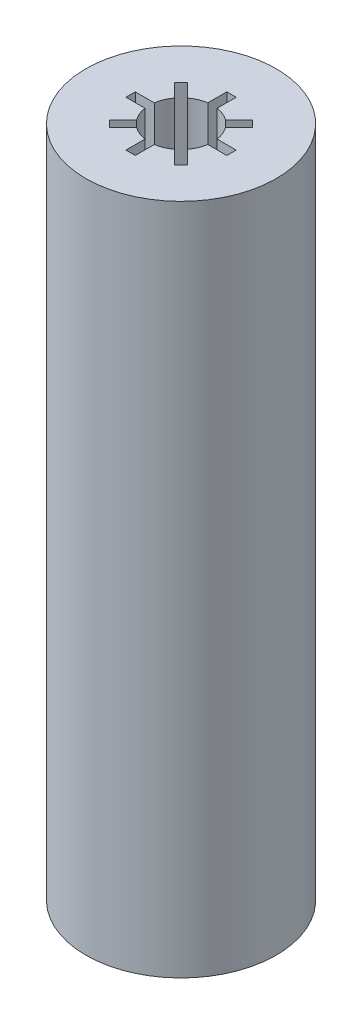
ISO-10303-21;
HEADER;
FILE_DESCRIPTION(('STEP AP214'),'2;1');
FILE_NAME('part.step','',(''),(''),'','','');
FILE_SCHEMA(('AUTOMOTIVE_DESIGN { 1 0 10303 214 1 1 1 1 }'));
ENDSEC;
DATA;
#1=APPLICATION_CONTEXT('core data for automotive mechanical design processes');
#2=APPLICATION_PROTOCOL_DEFINITION('international standard','automotive_design',2000,#1);
#3=PRODUCT_CONTEXT('',#1,'mechanical');
#4=PRODUCT('Part','Part','',(#3));
#5=PRODUCT_RELATED_PRODUCT_CATEGORY('part','',(#4));
#6=PRODUCT_DEFINITION_FORMATION('','',#4);
#7=PRODUCT_DEFINITION_CONTEXT('part definition',#1,'design');
#8=PRODUCT_DEFINITION('design','',#6,#7);
#9=PRODUCT_DEFINITION_SHAPE('','',#8);
#10=(LENGTH_UNIT() NAMED_UNIT(*) SI_UNIT(.MILLI.,.METRE.));
#11=(NAMED_UNIT(*) PLANE_ANGLE_UNIT() SI_UNIT($,.RADIAN.));
#12=(NAMED_UNIT(*) SI_UNIT($,.STERADIAN.) SOLID_ANGLE_UNIT());
#13=UNCERTAINTY_MEASURE_WITH_UNIT(LENGTH_MEASURE(1.E-05),#10,'distance_accuracy_value','');
#14=(GEOMETRIC_REPRESENTATION_CONTEXT(3) GLOBAL_UNCERTAINTY_ASSIGNED_CONTEXT((#13)) GLOBAL_UNIT_ASSIGNED_CONTEXT((#10,
#11,#12)) REPRESENTATION_CONTEXT('',''));
#15=CARTESIAN_POINT('',(0.,0.,0.));
#16=DIRECTION('',(0.,0.,1.));
#17=DIRECTION('',(1.,0.,0.));
#18=AXIS2_PLACEMENT_3D('',#15,#16,#17);
#19=CARTESIAN_POINT('',(0.,457.2,0.));
#20=DIRECTION('',(0.,-1.,0.));
#21=DIRECTION('',(0.,0.,-1.));
#22=AXIS2_PLACEMENT_3D('',#19,#20,#21);
#23=CYLINDRICAL_SURFACE('',#22,21.59);
#24=DIRECTION('',(0.,1.,0.));
#25=VECTOR('',#24,1.);
#26=CARTESIAN_POINT('',(21.3552680854163,-0.000999999999973245,3.17500000000007));
#27=LINE('',#26,#25);
#28=CARTESIAN_POINT('',(21.3552680854163,0.,3.17500000000007));
#29=VERTEX_POINT('',#28);
#30=CARTESIAN_POINT('',(21.3552680854163,457.2,3.17500000000007));
#31=VERTEX_POINT('',#30);
#32=EDGE_CURVE('E376',#29,#31,#27,.T.);
#33=ORIENTED_EDGE('',*,*,#32,.F.);
#34=CARTESIAN_POINT('',(0.,0.,0.));
#35=DIRECTION('',(0.,1.,0.));
#36=DIRECTION('',(0.,0.,1.));
#37=AXIS2_PLACEMENT_3D('',#34,#35,#36);
#38=CIRCLE('',#37,21.59);
#39=CARTESIAN_POINT('',(17.3455189075217,0.,12.8553908469873));
#40=VERTEX_POINT('',#39);
#41=EDGE_CURVE('E588',#40,#29,#38,.T.);
#42=ORIENTED_EDGE('',*,*,#41,.F.);
#43=DIRECTION('',(0.,1.,0.));
#44=VECTOR('',#43,1.);
#45=CARTESIAN_POINT('',(17.3455189075217,-0.000999999999973245,12.8553908469873));
#46=LINE('',#45,#44);
#47=CARTESIAN_POINT('',(17.3455189075217,457.2,12.8553908469873));
#48=VERTEX_POINT('',#47);
#49=EDGE_CURVE('E415',#40,#48,#46,.T.);
#50=ORIENTED_EDGE('',*,*,#49,.T.);
#51=CARTESIAN_POINT('',(0.,457.2,0.));
#52=DIRECTION('',(0.,1.,0.));
#53=DIRECTION('',(0.,0.,1.));
#54=AXIS2_PLACEMENT_3D('',#51,#52,#53);
#55=CIRCLE('',#54,21.59);
#56=EDGE_CURVE('E666',#48,#31,#55,.T.);
#57=ORIENTED_EDGE('',*,*,#56,.T.);
#58=EDGE_LOOP('',(#33,#42,#50,#57));
#59=FACE_BOUND('',#58,.T.);
#60=ADVANCED_FACE('F47',(#59),#23,.F.);
#61=DIRECTION('',(0.,1.,0.));
#62=VECTOR('',#61,1.);
#63=CARTESIAN_POINT('',(12.8553908469871,-0.000999999999973245,17.3455189075219));
#64=LINE('',#63,#62);
#65=CARTESIAN_POINT('',(12.8553908469871,0.,17.3455189075219));
#66=VERTEX_POINT('',#65);
#67=CARTESIAN_POINT('',(12.8553908469871,457.2,17.3455189075219));
#68=VERTEX_POINT('',#67);
#69=EDGE_CURVE('E412',#66,#68,#64,.T.);
#70=ORIENTED_EDGE('',*,*,#69,.F.);
#71=CARTESIAN_POINT('',(3.175,0.,21.3552680854163));
#72=VERTEX_POINT('',#71);
#73=EDGE_CURVE('E593',#72,#66,#38,.T.);
#74=ORIENTED_EDGE('',*,*,#73,.F.);
#75=DIRECTION('',(0.,1.,0.));
#76=VECTOR('',#75,1.);
#77=CARTESIAN_POINT('',(3.175,-0.000999999999973245,21.3552680854163));
#78=LINE('',#77,#76);
#79=CARTESIAN_POINT('',(3.175,457.2,21.3552680854163));
#80=VERTEX_POINT('',#79);
#81=EDGE_CURVE('E450',#72,#80,#78,.T.);
#82=ORIENTED_EDGE('',*,*,#81,.T.);
#83=EDGE_CURVE('E652',#80,#68,#55,.T.);
#84=ORIENTED_EDGE('',*,*,#83,.T.);
#85=EDGE_LOOP('',(#70,#74,#82,#84));
#86=FACE_BOUND('',#85,.T.);
#87=ADVANCED_FACE('F650',(#86),#23,.F.);
#88=DIRECTION('',(0.,1.,0.));
#89=VECTOR('',#88,1.);
#90=CARTESIAN_POINT('',(-3.175,-0.000999999999973245,21.3552680854163));
#91=LINE('',#90,#89);
#92=CARTESIAN_POINT('',(-3.175,0.,21.3552680854163));
#93=VERTEX_POINT('',#92);
#94=CARTESIAN_POINT('',(-3.175,457.2,21.3552680854163));
#95=VERTEX_POINT('',#94);
#96=EDGE_CURVE('E447',#93,#95,#91,.T.);
#97=ORIENTED_EDGE('',*,*,#96,.F.);
#98=CARTESIAN_POINT('',(-12.8553908469874,0.,17.3455189075217));
#99=VERTEX_POINT('',#98);
#100=EDGE_CURVE('E599',#99,#93,#38,.T.);
#101=ORIENTED_EDGE('',*,*,#100,.F.);
#102=DIRECTION('',(0.,1.,0.));
#103=VECTOR('',#102,1.);
#104=CARTESIAN_POINT('',(-12.8553908469874,-0.000999999999973245,17.3455189075217));
#105=LINE('',#104,#103);
#106=CARTESIAN_POINT('',(-12.8553908469874,457.2,17.3455189075217));
#107=VERTEX_POINT('',#106);
#108=EDGE_CURVE('E483',#99,#107,#105,.T.);
#109=ORIENTED_EDGE('',*,*,#108,.T.);
#110=EDGE_CURVE('E637',#107,#95,#55,.T.);
#111=ORIENTED_EDGE('',*,*,#110,.T.);
#112=EDGE_LOOP('',(#97,#101,#109,#111));
#113=FACE_BOUND('',#112,.T.);
#114=ADVANCED_FACE('F635',(#113),#23,.F.);
#115=DIRECTION('',(0.,1.,0.));
#116=VECTOR('',#115,1.);
#117=CARTESIAN_POINT('',(-17.3455189075219,-0.000999999999973245,12.8553908469871));
#118=LINE('',#117,#116);
#119=CARTESIAN_POINT('',(-17.3455189075219,0.,12.8553908469871));
#120=VERTEX_POINT('',#119);
#121=CARTESIAN_POINT('',(-17.3455189075219,457.2,12.8553908469871));
#122=VERTEX_POINT('',#121);
#123=EDGE_CURVE('E480',#120,#122,#118,.T.);
#124=ORIENTED_EDGE('',*,*,#123,.F.);
#125=CARTESIAN_POINT('',(-21.3552680854163,0.,3.17499999999978));
#126=VERTEX_POINT('',#125);
#127=EDGE_CURVE('E580',#126,#120,#38,.T.);
#128=ORIENTED_EDGE('',*,*,#127,.F.);
#129=DIRECTION('',(0.,1.,0.));
#130=VECTOR('',#129,1.);
#131=CARTESIAN_POINT('',(-21.3552680854163,-0.000999999999973245,3.17499999999978));
#132=LINE('',#131,#130);
#133=CARTESIAN_POINT('',(-21.3552680854163,457.2,3.17499999999978));
#134=VERTEX_POINT('',#133);
#135=EDGE_CURVE('E317',#126,#134,#132,.T.);
#136=ORIENTED_EDGE('',*,*,#135,.T.);
#137=EDGE_CURVE('E618',#134,#122,#55,.T.);
#138=ORIENTED_EDGE('',*,*,#137,.T.);
#139=EDGE_LOOP('',(#124,#128,#136,#138));
#140=FACE_BOUND('',#139,.T.);
#141=ADVANCED_FACE('F615',(#140),#23,.F.);
#142=DIRECTION('',(0.,1.,0.));
#143=VECTOR('',#142,1.);
#144=CARTESIAN_POINT('',(-21.3552680854163,-0.000999999999973245,-3.17500000000022));
#145=LINE('',#144,#143);
#146=CARTESIAN_POINT('',(-21.3552680854163,0.,-3.17500000000022));
#147=VERTEX_POINT('',#146);
#148=CARTESIAN_POINT('',(-21.3552680854163,457.2,-3.17500000000022));
#149=VERTEX_POINT('',#148);
#150=EDGE_CURVE('E292',#147,#149,#145,.T.);
#151=ORIENTED_EDGE('',*,*,#150,.F.);
#152=CARTESIAN_POINT('',(-17.3455189075217,0.,-12.8553908469874));
#153=VERTEX_POINT('',#152);
#154=EDGE_CURVE('E300',#153,#147,#38,.T.);
#155=ORIENTED_EDGE('',*,*,#154,.F.);
#156=DIRECTION('',(0.,1.,0.));
#157=VECTOR('',#156,1.);
#158=CARTESIAN_POINT('',(-17.3455189075217,-0.000999999999973245,-12.8553908469874));
#159=LINE('',#158,#157);
#160=CARTESIAN_POINT('',(-17.3455189075217,457.2,-12.8553908469875));
#161=VERTEX_POINT('',#160);
#162=EDGE_CURVE('E345',#153,#161,#159,.T.);
#163=ORIENTED_EDGE('',*,*,#162,.T.);
#164=EDGE_CURVE('E569',#161,#149,#55,.T.);
#165=ORIENTED_EDGE('',*,*,#164,.T.);
#166=EDGE_LOOP('',(#151,#155,#163,#165));
#167=FACE_BOUND('',#166,.T.);
#168=ADVANCED_FACE('F713',(#167),#23,.F.);
#169=DIRECTION('',(0.,1.,0.));
#170=VECTOR('',#169,1.);
#171=CARTESIAN_POINT('',(-12.855390846987,-0.000999999999973245,-17.345518907522));
#172=LINE('',#171,#170);
#173=CARTESIAN_POINT('',(-12.855390846987,0.,-17.345518907522));
#174=VERTEX_POINT('',#173);
#175=CARTESIAN_POINT('',(-12.855390846987,457.2,-17.345518907522));
#176=VERTEX_POINT('',#175);
#177=EDGE_CURVE('E342',#174,#176,#172,.T.);
#178=ORIENTED_EDGE('',*,*,#177,.F.);
#179=CARTESIAN_POINT('',(-3.175,0.,-21.3552680854163));
#180=VERTEX_POINT('',#179);
#181=EDGE_CURVE('E571',#180,#174,#38,.T.);
#182=ORIENTED_EDGE('',*,*,#181,.F.);
#183=DIRECTION('',(0.,1.,0.));
#184=VECTOR('',#183,1.);
#185=CARTESIAN_POINT('',(-3.175,-0.000999999999973245,-21.3552680854163));
#186=LINE('',#185,#184);
#187=CARTESIAN_POINT('',(-3.175,457.2,-21.3552680854163));
#188=VERTEX_POINT('',#187);
#189=EDGE_CURVE('E552',#180,#188,#186,.T.);
#190=ORIENTED_EDGE('',*,*,#189,.T.);
#191=EDGE_CURVE('E565',#188,#176,#55,.T.);
#192=ORIENTED_EDGE('',*,*,#191,.T.);
#193=EDGE_LOOP('',(#178,#182,#190,#192));
#194=FACE_BOUND('',#193,.T.);
#195=ADVANCED_FACE('F701',(#194),#23,.F.);
#196=DIRECTION('',(0.,1.,0.));
#197=VECTOR('',#196,1.);
#198=CARTESIAN_POINT('',(21.3552680854163,-0.000999999999973245,-3.17499999999993));
#199=LINE('',#198,#197);
#200=CARTESIAN_POINT('',(21.3552680854163,0.,-3.17499999999993));
#201=VERTEX_POINT('',#200);
#202=CARTESIAN_POINT('',(21.3552680854163,457.2,-3.17499999999993));
#203=VERTEX_POINT('',#202);
#204=EDGE_CURVE('E380',#201,#203,#199,.T.);
#205=ORIENTED_EDGE('',*,*,#204,.T.);
#206=CARTESIAN_POINT('',(17.3455189075218,457.2,-12.8553908469872));
#207=VERTEX_POINT('',#206);
#208=EDGE_CURVE('E579',#203,#207,#55,.T.);
#209=ORIENTED_EDGE('',*,*,#208,.T.);
#210=DIRECTION('',(0.,1.,0.));
#211=VECTOR('',#210,1.);
#212=CARTESIAN_POINT('',(17.3455189075218,-0.000999999999973245,-12.8553908469872));
#213=LINE('',#212,#211);
#214=CARTESIAN_POINT('',(17.3455189075218,0.,-12.8553908469872));
#215=VERTEX_POINT('',#214);
#216=EDGE_CURVE('E512',#215,#207,#213,.T.);
#217=ORIENTED_EDGE('',*,*,#216,.F.);
#218=EDGE_CURVE('E582',#201,#215,#38,.T.);
#219=ORIENTED_EDGE('',*,*,#218,.F.);
#220=EDGE_LOOP('',(#205,#209,#217,#219));
#221=FACE_BOUND('',#220,.T.);
#222=ADVANCED_FACE('F676',(#221),#23,.F.);
#223=CARTESIAN_POINT('',(0.,457.2,0.));
#224=DIRECTION('',(0.,1.,0.));
#225=DIRECTION('',(0.,0.,1.));
#226=AXIS2_PLACEMENT_3D('',#223,#224,#225);
#227=PLANE('',#226);
#228=DIRECTION('',(1.,0.,0.));
#229=VECTOR('',#228,1.);
#230=CARTESIAN_POINT('',(34.29,457.2,3.17500000000012));
#231=LINE('',#230,#229);
#232=CARTESIAN_POINT('',(34.29,457.2,3.17500000000012));
#233=VERTEX_POINT('',#232);
#234=EDGE_CURVE('E365',#31,#233,#231,.T.);
#235=ORIENTED_EDGE('',*,*,#234,.F.);
#236=ORIENTED_EDGE('',*,*,#56,.F.);
#237=DIRECTION('',(-0.707106781186544,0.,-0.707106781186551));
#238=VECTOR('',#237,1.);
#239=CARTESIAN_POINT('',(26.4917555571539,457.2,22.0016274966196));
#240=LINE('',#239,#238);
#241=CARTESIAN_POINT('',(26.4917555571539,457.2,22.0016274966196));
#242=VERTEX_POINT('',#241);
#243=EDGE_CURVE('E408',#242,#48,#240,.T.);
#244=ORIENTED_EDGE('',*,*,#243,.F.);
#245=DIRECTION('',(0.707106781186551,0.,-0.707106781186544));
#246=VECTOR('',#245,1.);
#247=CARTESIAN_POINT('',(26.4917555571539,457.2,22.0016274966196));
#248=LINE('',#247,#246);
#249=CARTESIAN_POINT('',(22.0016274966193,457.2,26.4917555571541));
#250=VERTEX_POINT('',#249);
#251=EDGE_CURVE('E404',#250,#242,#248,.T.);
#252=ORIENTED_EDGE('',*,*,#251,.F.);
#253=DIRECTION('',(0.707106781186544,0.,0.707106781186551));
#254=VECTOR('',#253,1.);
#255=CARTESIAN_POINT('',(22.0016274966193,457.2,26.4917555571541));
#256=LINE('',#255,#254);
#257=EDGE_CURVE('E400',#68,#250,#256,.T.);
#258=ORIENTED_EDGE('',*,*,#257,.F.);
#259=ORIENTED_EDGE('',*,*,#83,.F.);
#260=DIRECTION('',(0.,0.,-1.));
#261=VECTOR('',#260,1.);
#262=CARTESIAN_POINT('',(3.175,457.2,34.29));
#263=LINE('',#262,#261);
#264=CARTESIAN_POINT('',(3.175,457.2,34.29));
#265=VERTEX_POINT('',#264);
#266=EDGE_CURVE('E443',#265,#80,#263,.T.);
#267=ORIENTED_EDGE('',*,*,#266,.F.);
#268=DIRECTION('',(1.,0.,0.));
#269=VECTOR('',#268,1.);
#270=CARTESIAN_POINT('',(3.175,457.2,34.29));
#271=LINE('',#270,#269);
#272=CARTESIAN_POINT('',(-3.175,457.2,34.29));
#273=VERTEX_POINT('',#272);
#274=EDGE_CURVE('E439',#273,#265,#271,.T.);
#275=ORIENTED_EDGE('',*,*,#274,.F.);
#276=DIRECTION('',(0.,0.,1.));
#277=VECTOR('',#276,1.);
#278=CARTESIAN_POINT('',(-3.175,457.2,34.29));
#279=LINE('',#278,#277);
#280=EDGE_CURVE('E435',#95,#273,#279,.T.);
#281=ORIENTED_EDGE('',*,*,#280,.F.);
#282=ORIENTED_EDGE('',*,*,#110,.F.);
#283=DIRECTION('',(0.707106781186554,0.,-0.707106781186541));
#284=VECTOR('',#283,1.);
#285=CARTESIAN_POINT('',(-22.0016274966197,457.2,26.4917555571538));
#286=LINE('',#285,#284);
#287=CARTESIAN_POINT('',(-22.0016274966197,457.2,26.4917555571538));
#288=VERTEX_POINT('',#287);
#289=EDGE_CURVE('E476',#288,#107,#286,.T.);
#290=ORIENTED_EDGE('',*,*,#289,.F.);
#291=DIRECTION('',(0.707106781186541,0.,0.707106781186554));
#292=VECTOR('',#291,1.);
#293=CARTESIAN_POINT('',(-22.0016274966197,457.2,26.4917555571538));
#294=LINE('',#293,#292);
#295=CARTESIAN_POINT('',(-26.4917555571542,457.2,22.0016274966192));
#296=VERTEX_POINT('',#295);
#297=EDGE_CURVE('E472',#296,#288,#294,.T.);
#298=ORIENTED_EDGE('',*,*,#297,.F.);
#299=DIRECTION('',(-0.707106781186554,0.,0.707106781186541));
#300=VECTOR('',#299,1.);
#301=CARTESIAN_POINT('',(-26.4917555571542,457.2,22.0016274966192));
#302=LINE('',#301,#300);
#303=EDGE_CURVE('E468',#122,#296,#302,.T.);
#304=ORIENTED_EDGE('',*,*,#303,.F.);
#305=ORIENTED_EDGE('',*,*,#137,.F.);
#306=DIRECTION('',(1.,0.,0.));
#307=VECTOR('',#306,1.);
#308=CARTESIAN_POINT('',(-34.29,457.2,3.17499999999964));
#309=LINE('',#308,#307);
#310=CARTESIAN_POINT('',(-34.29,457.2,3.17499999999964));
#311=VERTEX_POINT('',#310);
#312=EDGE_CURVE('E282',#311,#134,#309,.T.);
#313=ORIENTED_EDGE('',*,*,#312,.F.);
#314=DIRECTION('',(0.,0.,1.));
#315=VECTOR('',#314,1.);
#316=CARTESIAN_POINT('',(-34.29,457.2,3.17499999999964));
#317=LINE('',#316,#315);
#318=CARTESIAN_POINT('',(-34.29,457.2,-3.17500000000036));
#319=VERTEX_POINT('',#318);
#320=EDGE_CURVE('E306',#319,#311,#317,.T.);
#321=ORIENTED_EDGE('',*,*,#320,.F.);
#322=DIRECTION('',(-1.,0.,0.));
#323=VECTOR('',#322,1.);
#324=CARTESIAN_POINT('',(-34.29,457.2,-3.17500000000036));
#325=LINE('',#324,#323);
#326=EDGE_CURVE('E276',#149,#319,#325,.T.);
#327=ORIENTED_EDGE('',*,*,#326,.F.);
#328=ORIENTED_EDGE('',*,*,#164,.F.);
#329=DIRECTION('',(0.707106781186539,0.,0.707106781186556));
#330=VECTOR('',#329,1.);
#331=CARTESIAN_POINT('',(-26.4917555571537,457.2,-22.0016274966197));
#332=LINE('',#331,#330);
#333=CARTESIAN_POINT('',(-26.4917555571537,457.2,-22.0016274966197));
#334=VERTEX_POINT('',#333);
#335=EDGE_CURVE('E338',#334,#161,#332,.T.);
#336=ORIENTED_EDGE('',*,*,#335,.F.);
#337=DIRECTION('',(-0.707106781186556,0.,0.707106781186539));
#338=VECTOR('',#337,1.);
#339=CARTESIAN_POINT('',(-26.4917555571537,457.2,-22.0016274966197));
#340=LINE('',#339,#338);
#341=CARTESIAN_POINT('',(-22.0016274966191,457.2,-26.4917555571543));
#342=VERTEX_POINT('',#341);
#343=EDGE_CURVE('E334',#342,#334,#340,.T.);
#344=ORIENTED_EDGE('',*,*,#343,.F.);
#345=DIRECTION('',(-0.707106781186539,0.,-0.707106781186556));
#346=VECTOR('',#345,1.);
#347=CARTESIAN_POINT('',(-22.0016274966191,457.2,-26.4917555571543));
#348=LINE('',#347,#346);
#349=EDGE_CURVE('E330',#176,#342,#348,.T.);
#350=ORIENTED_EDGE('',*,*,#349,.F.);
#351=ORIENTED_EDGE('',*,*,#191,.F.);
#352=DIRECTION('',(0.,0.,1.));
#353=VECTOR('',#352,1.);
#354=CARTESIAN_POINT('',(-3.175,457.2,-34.29));
#355=LINE('',#354,#353);
#356=CARTESIAN_POINT('',(-3.175,457.2,-34.29));
#357=VERTEX_POINT('',#356);
#358=EDGE_CURVE('E543',#357,#188,#355,.T.);
#359=ORIENTED_EDGE('',*,*,#358,.F.);
#360=DIRECTION('',(-1.,0.,0.));
#361=VECTOR('',#360,1.);
#362=CARTESIAN_POINT('',(-3.175,457.2,-34.29));
#363=LINE('',#362,#361);
#364=CARTESIAN_POINT('',(3.175,457.2,-34.29));
#365=VERTEX_POINT('',#364);
#366=EDGE_CURVE('E539',#365,#357,#363,.T.);
#367=ORIENTED_EDGE('',*,*,#366,.F.);
#368=DIRECTION('',(0.,0.,-1.));
#369=VECTOR('',#368,1.);
#370=CARTESIAN_POINT('',(3.175,457.2,-34.29));
#371=LINE('',#370,#369);
#372=CARTESIAN_POINT('',(3.175,457.2,-21.3552680854163));
#373=VERTEX_POINT('',#372);
#374=EDGE_CURVE('E535',#373,#365,#371,.T.);
#375=ORIENTED_EDGE('',*,*,#374,.F.);
#376=CARTESIAN_POINT('',(12.8553908469873,457.2,-17.3455189075218));
#377=VERTEX_POINT('',#376);
#378=EDGE_CURVE('E570',#377,#373,#55,.T.);
#379=ORIENTED_EDGE('',*,*,#378,.F.);
#380=DIRECTION('',(-0.707106781186549,0.,0.707106781186546));
#381=VECTOR('',#380,1.);
#382=CARTESIAN_POINT('',(22.0016274966195,457.2,-26.491755557154));
#383=LINE('',#382,#381);
#384=CARTESIAN_POINT('',(22.0016274966195,457.2,-26.491755557154));
#385=VERTEX_POINT('',#384);
#386=EDGE_CURVE('E63',#385,#377,#383,.T.);
#387=ORIENTED_EDGE('',*,*,#386,.F.);
#388=DIRECTION('',(-0.707106781186546,0.,-0.707106781186549));
#389=VECTOR('',#388,1.);
#390=CARTESIAN_POINT('',(22.0016274966195,457.2,-26.491755557154));
#391=LINE('',#390,#389);
#392=CARTESIAN_POINT('',(26.491755557154,457.2,-22.0016274966194));
#393=VERTEX_POINT('',#392);
#394=EDGE_CURVE('E505',#393,#385,#391,.T.);
#395=ORIENTED_EDGE('',*,*,#394,.F.);
#396=DIRECTION('',(0.707106781186549,0.,-0.707106781186546));
#397=VECTOR('',#396,1.);
#398=CARTESIAN_POINT('',(26.491755557154,457.2,-22.0016274966194));
#399=LINE('',#398,#397);
#400=EDGE_CURVE('E501',#207,#393,#399,.T.);
#401=ORIENTED_EDGE('',*,*,#400,.F.);
#402=ORIENTED_EDGE('',*,*,#208,.F.);
#403=DIRECTION('',(-1.,0.,0.));
#404=VECTOR('',#403,1.);
#405=CARTESIAN_POINT('',(34.29,457.2,-3.17499999999988));
#406=LINE('',#405,#404);
#407=CARTESIAN_POINT('',(34.29,457.2,-3.17499999999988));
#408=VERTEX_POINT('',#407);
#409=EDGE_CURVE('E71',#408,#203,#406,.T.);
#410=ORIENTED_EDGE('',*,*,#409,.F.);
#411=DIRECTION('',(0.,0.,-1.));
#412=VECTOR('',#411,1.);
#413=CARTESIAN_POINT('',(34.29,457.2,-3.17499999999988));
#414=LINE('',#413,#412);
#415=EDGE_CURVE('E369',#233,#408,#414,.T.);
#416=ORIENTED_EDGE('',*,*,#415,.F.);
#417=EDGE_LOOP('',(#235,#236,#244,#252,#258,#259,#267,#275,#281,#282,#290,#298,#304,#305,#313,
#321,#327,#328,#336,#344,#350,#351,#359,#367,#375,#379,#387,#395,#401,#402,#410,#416));
#418=FACE_BOUND('',#417,.T.);
#419=CARTESIAN_POINT('',(0.,457.2,0.));
#420=DIRECTION('',(0.,1.,0.));
#421=DIRECTION('',(0.,0.,1.));
#422=AXIS2_PLACEMENT_3D('',#419,#420,#421);
#423=CIRCLE('',#422,64.7065);
#424=CARTESIAN_POINT('',(0.,457.2,64.7065));
#425=VERTEX_POINT('',#424);
#426=EDGE_CURVE('E11',#425,#425,#423,.T.);
#427=ORIENTED_EDGE('',*,*,#426,.T.);
#428=EDGE_LOOP('',(#427));
#429=FACE_BOUND('',#428,.T.);
#430=ADVANCED_FACE('F625',(#418,#429),#227,.T.);
#431=CARTESIAN_POINT('',(0.,0.,0.));
#432=DIRECTION('',(0.,1.,0.));
#433=DIRECTION('',(0.,0.,1.));
#434=AXIS2_PLACEMENT_3D('',#431,#432,#433);
#435=PLANE('',#434);
#436=ORIENTED_EDGE('',*,*,#41,.T.);
#437=DIRECTION('',(-1.,0.,0.));
#438=VECTOR('',#437,1.);
#439=CARTESIAN_POINT('',(34.29,0.,3.17500000000012));
#440=LINE('',#439,#438);
#441=CARTESIAN_POINT('',(34.29,0.,3.17500000000012));
#442=VERTEX_POINT('',#441);
#443=EDGE_CURVE('E361',#442,#29,#440,.T.);
#444=ORIENTED_EDGE('',*,*,#443,.F.);
#445=DIRECTION('',(0.,0.,1.));
#446=VECTOR('',#445,1.);
#447=CARTESIAN_POINT('',(34.29,0.,-3.17499999999988));
#448=LINE('',#447,#446);
#449=CARTESIAN_POINT('',(34.29,0.,-3.17499999999988));
#450=VERTEX_POINT('',#449);
#451=EDGE_CURVE('E379',#450,#442,#448,.T.);
#452=ORIENTED_EDGE('',*,*,#451,.F.);
#453=DIRECTION('',(1.,0.,0.));
#454=VECTOR('',#453,1.);
#455=CARTESIAN_POINT('',(34.29,0.,-3.17499999999988));
#456=LINE('',#455,#454);
#457=EDGE_CURVE('E357',#201,#450,#456,.T.);
#458=ORIENTED_EDGE('',*,*,#457,.F.);
#459=ORIENTED_EDGE('',*,*,#218,.T.);
#460=DIRECTION('',(-0.707106781186549,0.,0.707106781186546));
#461=VECTOR('',#460,1.);
#462=CARTESIAN_POINT('',(26.491755557154,0.,-22.0016274966194));
#463=LINE('',#462,#461);
#464=CARTESIAN_POINT('',(26.491755557154,0.,-22.0016274966194));
#465=VERTEX_POINT('',#464);
#466=EDGE_CURVE('E498',#465,#215,#463,.T.);
#467=ORIENTED_EDGE('',*,*,#466,.F.);
#468=DIRECTION('',(0.707106781186546,0.,0.707106781186549));
#469=VECTOR('',#468,1.);
#470=CARTESIAN_POINT('',(22.0016274966195,0.,-26.491755557154));
#471=LINE('',#470,#469);
#472=CARTESIAN_POINT('',(22.0016274966195,0.,-26.491755557154));
#473=VERTEX_POINT('',#472);
#474=EDGE_CURVE('E515',#473,#465,#471,.T.);
#475=ORIENTED_EDGE('',*,*,#474,.F.);
#476=DIRECTION('',(0.707106781186549,0.,-0.707106781186546));
#477=VECTOR('',#476,1.);
#478=CARTESIAN_POINT('',(22.0016274966195,0.,-26.491755557154));
#479=LINE('',#478,#477);
#480=CARTESIAN_POINT('',(12.8553908469873,0.,-17.3455189075218));
#481=VERTEX_POINT('',#480);
#482=EDGE_CURVE('E391',#481,#473,#479,.T.);
#483=ORIENTED_EDGE('',*,*,#482,.F.);
#484=CARTESIAN_POINT('',(3.175,0.,-21.3552680854163));
#485=VERTEX_POINT('',#484);
#486=EDGE_CURVE('E564',#481,#485,#38,.T.);
#487=ORIENTED_EDGE('',*,*,#486,.T.);
#488=DIRECTION('',(0.,0.,1.));
#489=VECTOR('',#488,1.);
#490=CARTESIAN_POINT('',(3.175,0.,-34.29));
#491=LINE('',#490,#489);
#492=CARTESIAN_POINT('',(3.175,0.,-34.29));
#493=VERTEX_POINT('',#492);
#494=EDGE_CURVE('E531',#493,#485,#491,.T.);
#495=ORIENTED_EDGE('',*,*,#494,.F.);
#496=DIRECTION('',(1.,0.,0.));
#497=VECTOR('',#496,1.);
#498=CARTESIAN_POINT('',(-3.175,0.,-34.29));
#499=LINE('',#498,#497);
#500=CARTESIAN_POINT('',(-3.175,0.,-34.29));
#501=VERTEX_POINT('',#500);
#502=EDGE_CURVE('E551',#501,#493,#499,.T.);
#503=ORIENTED_EDGE('',*,*,#502,.F.);
#504=DIRECTION('',(0.,0.,-1.));
#505=VECTOR('',#504,1.);
#506=CARTESIAN_POINT('',(-3.175,0.,-34.29));
#507=LINE('',#506,#505);
#508=EDGE_CURVE('E527',#180,#501,#507,.T.);
#509=ORIENTED_EDGE('',*,*,#508,.F.);
#510=ORIENTED_EDGE('',*,*,#181,.T.);
#511=DIRECTION('',(0.707106781186539,0.,0.707106781186556));
#512=VECTOR('',#511,1.);
#513=CARTESIAN_POINT('',(-22.0016274966191,0.,-26.4917555571543));
#514=LINE('',#513,#512);
#515=CARTESIAN_POINT('',(-22.0016274966191,0.,-26.4917555571543));
#516=VERTEX_POINT('',#515);
#517=EDGE_CURVE('E327',#516,#174,#514,.T.);
#518=ORIENTED_EDGE('',*,*,#517,.F.);
#519=DIRECTION('',(0.707106781186556,0.,-0.707106781186539));
#520=VECTOR('',#519,1.);
#521=CARTESIAN_POINT('',(-26.4917555571537,0.,-22.0016274966197));
#522=LINE('',#521,#520);
#523=CARTESIAN_POINT('',(-26.4917555571537,0.,-22.0016274966197));
#524=VERTEX_POINT('',#523);
#525=EDGE_CURVE('E308',#524,#516,#522,.T.);
#526=ORIENTED_EDGE('',*,*,#525,.F.);
#527=DIRECTION('',(-0.707106781186539,0.,-0.707106781186556));
#528=VECTOR('',#527,1.);
#529=CARTESIAN_POINT('',(-26.4917555571537,0.,-22.0016274966197));
#530=LINE('',#529,#528);
#531=EDGE_CURVE('E323',#153,#524,#530,.T.);
#532=ORIENTED_EDGE('',*,*,#531,.F.);
#533=ORIENTED_EDGE('',*,*,#154,.T.);
#534=DIRECTION('',(1.,0.,0.));
#535=VECTOR('',#534,1.);
#536=CARTESIAN_POINT('',(-34.29,0.,-3.17500000000036));
#537=LINE('',#536,#535);
#538=CARTESIAN_POINT('',(-34.29,0.,-3.17500000000036));
#539=VERTEX_POINT('',#538);
#540=EDGE_CURVE('E273',#539,#147,#537,.T.);
#541=ORIENTED_EDGE('',*,*,#540,.F.);
#542=DIRECTION('',(0.,0.,-1.));
#543=VECTOR('',#542,1.);
#544=CARTESIAN_POINT('',(-34.29,0.,3.17499999999964));
#545=LINE('',#544,#543);
#546=CARTESIAN_POINT('',(-34.29,0.,3.17499999999964));
#547=VERTEX_POINT('',#546);
#548=EDGE_CURVE('E285',#547,#539,#545,.T.);
#549=ORIENTED_EDGE('',*,*,#548,.F.);
#550=DIRECTION('',(-1.,0.,0.));
#551=VECTOR('',#550,1.);
#552=CARTESIAN_POINT('',(-34.29,0.,3.17499999999964));
#553=LINE('',#552,#551);
#554=EDGE_CURVE('E302',#126,#547,#553,.T.);
#555=ORIENTED_EDGE('',*,*,#554,.F.);
#556=ORIENTED_EDGE('',*,*,#127,.T.);
#557=DIRECTION('',(0.707106781186554,0.,-0.707106781186541));
#558=VECTOR('',#557,1.);
#559=CARTESIAN_POINT('',(-26.4917555571542,0.,22.0016274966192));
#560=LINE('',#559,#558);
#561=CARTESIAN_POINT('',(-26.4917555571542,0.,22.0016274966192));
#562=VERTEX_POINT('',#561);
#563=EDGE_CURVE('E465',#562,#120,#560,.T.);
#564=ORIENTED_EDGE('',*,*,#563,.F.);
#565=DIRECTION('',(-0.707106781186541,0.,-0.707106781186554));
#566=VECTOR('',#565,1.);
#567=CARTESIAN_POINT('',(-22.0016274966197,0.,26.4917555571538));
#568=LINE('',#567,#566);
#569=CARTESIAN_POINT('',(-22.0016274966197,0.,26.4917555571538));
#570=VERTEX_POINT('',#569);
#571=EDGE_CURVE('E432',#570,#562,#568,.T.);
#572=ORIENTED_EDGE('',*,*,#571,.F.);
#573=DIRECTION('',(-0.707106781186554,0.,0.707106781186541));
#574=VECTOR('',#573,1.);
#575=CARTESIAN_POINT('',(-22.0016274966197,0.,26.4917555571538));
#576=LINE('',#575,#574);
#577=EDGE_CURVE('E291',#99,#570,#576,.T.);
#578=ORIENTED_EDGE('',*,*,#577,.F.);
#579=ORIENTED_EDGE('',*,*,#100,.T.);
#580=DIRECTION('',(0.,0.,-1.));
#581=VECTOR('',#580,1.);
#582=CARTESIAN_POINT('',(-3.175,0.,34.29));
#583=LINE('',#582,#581);
#584=CARTESIAN_POINT('',(-3.175,0.,34.29));
#585=VERTEX_POINT('',#584);
#586=EDGE_CURVE('E431',#585,#93,#583,.T.);
#587=ORIENTED_EDGE('',*,*,#586,.F.);
#588=DIRECTION('',(-1.,0.,0.));
#589=VECTOR('',#588,1.);
#590=CARTESIAN_POINT('',(3.175,0.,34.29));
#591=LINE('',#590,#589);
#592=CARTESIAN_POINT('',(3.175,0.,34.29));
#593=VERTEX_POINT('',#592);
#594=EDGE_CURVE('E397',#593,#585,#591,.T.);
#595=ORIENTED_EDGE('',*,*,#594,.F.);
#596=DIRECTION('',(0.,0.,1.));
#597=VECTOR('',#596,1.);
#598=CARTESIAN_POINT('',(3.175,0.,34.29));
#599=LINE('',#598,#597);
#600=EDGE_CURVE('E427',#72,#593,#599,.T.);
#601=ORIENTED_EDGE('',*,*,#600,.F.);
#602=ORIENTED_EDGE('',*,*,#73,.T.);
#603=DIRECTION('',(-0.707106781186544,0.,-0.707106781186551));
#604=VECTOR('',#603,1.);
#605=CARTESIAN_POINT('',(22.0016274966193,0.,26.4917555571541));
#606=LINE('',#605,#604);
#607=CARTESIAN_POINT('',(22.0016274966193,0.,26.4917555571541));
#608=VERTEX_POINT('',#607);
#609=EDGE_CURVE('E396',#608,#66,#606,.T.);
#610=ORIENTED_EDGE('',*,*,#609,.F.);
#611=DIRECTION('',(-0.707106781186551,0.,0.707106781186544));
#612=VECTOR('',#611,1.);
#613=CARTESIAN_POINT('',(26.4917555571539,0.,22.0016274966196));
#614=LINE('',#613,#612);
#615=CARTESIAN_POINT('',(26.4917555571539,0.,22.0016274966196));
#616=VERTEX_POINT('',#615);
#617=EDGE_CURVE('E362',#616,#608,#614,.T.);
#618=ORIENTED_EDGE('',*,*,#617,.F.);
#619=DIRECTION('',(0.707106781186544,0.,0.707106781186551));
#620=VECTOR('',#619,1.);
#621=CARTESIAN_POINT('',(26.4917555571539,0.,22.0016274966196));
#622=LINE('',#621,#620);
#623=EDGE_CURVE('E392',#40,#616,#622,.T.);
#624=ORIENTED_EDGE('',*,*,#623,.F.);
#625=EDGE_LOOP('',(#436,#444,#452,#458,#459,#467,#475,#483,#487,#495,#503,#509,#510,#518,#526,
#532,#533,#541,#549,#555,#556,#564,#572,#578,#579,#587,#595,#601,#602,#610,#618,#624));
#626=FACE_BOUND('',#625,.T.);
#627=CARTESIAN_POINT('',(0.,0.,0.));
#628=DIRECTION('',(0.,1.,0.));
#629=DIRECTION('',(0.,0.,1.));
#630=AXIS2_PLACEMENT_3D('',#627,#628,#629);
#631=CIRCLE('',#630,64.7065);
#632=CARTESIAN_POINT('',(0.,0.,64.7065));
#633=VERTEX_POINT('',#632);
#634=EDGE_CURVE('E51',#633,#633,#631,.T.);
#635=ORIENTED_EDGE('',*,*,#634,.F.);
#636=EDGE_LOOP('',(#635));
#637=FACE_BOUND('',#636,.T.);
#638=ADVANCED_FACE('F296',(#626,#637),#435,.F.);
#639=CARTESIAN_POINT('',(0.,457.2,0.));
#640=DIRECTION('',(0.,-1.,0.));
#641=DIRECTION('',(0.,0.,-1.));
#642=AXIS2_PLACEMENT_3D('',#639,#640,#641);
#643=CYLINDRICAL_SURFACE('',#642,64.7065);
#644=ORIENTED_EDGE('',*,*,#426,.F.);
#645=EDGE_LOOP('',(#644));
#646=FACE_BOUND('',#645,.T.);
#647=ORIENTED_EDGE('',*,*,#634,.T.);
#648=EDGE_LOOP('',(#647));
#649=FACE_BOUND('',#648,.T.);
#650=ADVANCED_FACE('F49',(#646,#649),#643,.T.);
#651=DIRECTION('',(0.,1.,0.));
#652=VECTOR('',#651,1.);
#653=CARTESIAN_POINT('',(12.8553908469873,-0.000999999999973245,-17.3455189075218));
#654=LINE('',#653,#652);
#655=EDGE_CURVE('E516',#481,#377,#654,.T.);
#656=ORIENTED_EDGE('',*,*,#655,.T.);
#657=ORIENTED_EDGE('',*,*,#378,.T.);
#658=DIRECTION('',(0.,1.,0.));
#659=VECTOR('',#658,1.);
#660=CARTESIAN_POINT('',(3.175,-0.000999999999973245,-21.3552680854163));
#661=LINE('',#660,#659);
#662=EDGE_CURVE('E547',#485,#373,#661,.T.);
#663=ORIENTED_EDGE('',*,*,#662,.F.);
#664=ORIENTED_EDGE('',*,*,#486,.F.);
#665=EDGE_LOOP('',(#656,#657,#663,#664));
#666=FACE_BOUND('',#665,.T.);
#667=ADVANCED_FACE('F688',(#666),#23,.F.);
#668=CARTESIAN_POINT('',(3.175,-0.000999999999973245,-34.29));
#669=DIRECTION('',(1.,0.,0.));
#670=DIRECTION('',(0.,0.,-1.));
#671=AXIS2_PLACEMENT_3D('',#668,#669,#670);
#672=PLANE('',#671);
#673=ORIENTED_EDGE('',*,*,#494,.T.);
#674=ORIENTED_EDGE('',*,*,#662,.T.);
#675=ORIENTED_EDGE('',*,*,#374,.T.);
#676=DIRECTION('',(0.,1.,0.));
#677=VECTOR('',#676,1.);
#678=CARTESIAN_POINT('',(3.175,-0.000999999999973245,-34.29));
#679=LINE('',#678,#677);
#680=EDGE_CURVE('E546',#493,#365,#679,.T.);
#681=ORIENTED_EDGE('',*,*,#680,.F.);
#682=EDGE_LOOP('',(#673,#674,#675,#681));
#683=FACE_BOUND('',#682,.T.);
#684=ADVANCED_FACE('F691',(#683),#672,.F.);
#685=CARTESIAN_POINT('',(-3.175,-0.000999999999973245,-34.29));
#686=DIRECTION('',(-1.,0.,0.));
#687=DIRECTION('',(0.,0.,1.));
#688=AXIS2_PLACEMENT_3D('',#685,#686,#687);
#689=PLANE('',#688);
#690=ORIENTED_EDGE('',*,*,#508,.T.);
#691=DIRECTION('',(0.,1.,0.));
#692=VECTOR('',#691,1.);
#693=CARTESIAN_POINT('',(-3.175,-0.000999999999973245,-34.29));
#694=LINE('',#693,#692);
#695=EDGE_CURVE('E556',#501,#357,#694,.T.);
#696=ORIENTED_EDGE('',*,*,#695,.T.);
#697=ORIENTED_EDGE('',*,*,#358,.T.);
#698=ORIENTED_EDGE('',*,*,#189,.F.);
#699=EDGE_LOOP('',(#690,#696,#697,#698));
#700=FACE_BOUND('',#699,.T.);
#701=ADVANCED_FACE('F737',(#700),#689,.F.);
#702=CARTESIAN_POINT('',(-3.175,-0.000999999999973245,-34.29));
#703=DIRECTION('',(0.,0.,-1.));
#704=DIRECTION('',(-1.,0.,0.));
#705=AXIS2_PLACEMENT_3D('',#702,#703,#704);
#706=PLANE('',#705);
#707=ORIENTED_EDGE('',*,*,#502,.T.);
#708=ORIENTED_EDGE('',*,*,#680,.T.);
#709=ORIENTED_EDGE('',*,*,#366,.T.);
#710=ORIENTED_EDGE('',*,*,#695,.F.);
#711=EDGE_LOOP('',(#707,#708,#709,#710));
#712=FACE_BOUND('',#711,.T.);
#713=ADVANCED_FACE('F696',(#712),#706,.F.);
#714=CARTESIAN_POINT('',(26.491755557154,-0.000999999999973245,-22.0016274966194));
#715=DIRECTION('',(0.707106781186546,0.,0.707106781186549));
#716=DIRECTION('',(0.707106781186549,0.,-0.707106781186546));
#717=AXIS2_PLACEMENT_3D('',#714,#715,#716);
#718=PLANE('',#717);
#719=ORIENTED_EDGE('',*,*,#466,.T.);
#720=ORIENTED_EDGE('',*,*,#216,.T.);
#721=ORIENTED_EDGE('',*,*,#400,.T.);
#722=DIRECTION('',(0.,1.,0.));
#723=VECTOR('',#722,1.);
#724=CARTESIAN_POINT('',(26.491755557154,-0.000999999999973245,-22.0016274966194));
#725=LINE('',#724,#723);
#726=EDGE_CURVE('E511',#465,#393,#725,.T.);
#727=ORIENTED_EDGE('',*,*,#726,.F.);
#728=EDGE_LOOP('',(#719,#720,#721,#727));
#729=FACE_BOUND('',#728,.T.);
#730=ADVANCED_FACE('F680',(#729),#718,.F.);
#731=CARTESIAN_POINT('',(22.0016274966195,-0.000999999999973245,-26.491755557154));
#732=DIRECTION('',(-0.707106781186546,0.,-0.707106781186549));
#733=DIRECTION('',(-0.707106781186549,0.,0.707106781186546));
#734=AXIS2_PLACEMENT_3D('',#731,#732,#733);
#735=PLANE('',#734);
#736=ORIENTED_EDGE('',*,*,#482,.T.);
#737=DIRECTION('',(0.,1.,0.));
#738=VECTOR('',#737,1.);
#739=CARTESIAN_POINT('',(22.0016274966195,-0.000999999999973245,-26.491755557154));
#740=LINE('',#739,#738);
#741=EDGE_CURVE('E519',#473,#385,#740,.T.);
#742=ORIENTED_EDGE('',*,*,#741,.T.);
#743=ORIENTED_EDGE('',*,*,#386,.T.);
#744=ORIENTED_EDGE('',*,*,#655,.F.);
#745=EDGE_LOOP('',(#736,#742,#743,#744));
#746=FACE_BOUND('',#745,.T.);
#747=ADVANCED_FACE('F820',(#746),#735,.F.);
#748=CARTESIAN_POINT('',(22.0016274966195,-0.000999999999973245,-26.491755557154));
#749=DIRECTION('',(0.707106781186549,0.,-0.707106781186546));
#750=DIRECTION('',(-0.707106781186546,0.,-0.707106781186549));
#751=AXIS2_PLACEMENT_3D('',#748,#749,#750);
#752=PLANE('',#751);
#753=ORIENTED_EDGE('',*,*,#474,.T.);
#754=ORIENTED_EDGE('',*,*,#726,.T.);
#755=ORIENTED_EDGE('',*,*,#394,.T.);
#756=ORIENTED_EDGE('',*,*,#741,.F.);
#757=EDGE_LOOP('',(#753,#754,#755,#756));
#758=FACE_BOUND('',#757,.T.);
#759=ADVANCED_FACE('F684',(#758),#752,.F.);
#760=CARTESIAN_POINT('',(-22.0016274966191,-0.000999999999973245,-26.4917555571543));
#761=DIRECTION('',(0.707106781186556,0.,-0.707106781186539));
#762=DIRECTION('',(-0.707106781186539,0.,-0.707106781186556));
#763=AXIS2_PLACEMENT_3D('',#760,#761,#762);
#764=PLANE('',#763);
#765=ORIENTED_EDGE('',*,*,#517,.T.);
#766=ORIENTED_EDGE('',*,*,#177,.T.);
#767=ORIENTED_EDGE('',*,*,#349,.T.);
#768=DIRECTION('',(0.,1.,0.));
#769=VECTOR('',#768,1.);
#770=CARTESIAN_POINT('',(-22.0016274966191,-0.000999999999973245,-26.4917555571543));
#771=LINE('',#770,#769);
#772=EDGE_CURVE('E341',#516,#342,#771,.T.);
#773=ORIENTED_EDGE('',*,*,#772,.F.);
#774=EDGE_LOOP('',(#765,#766,#767,#773));
#775=FACE_BOUND('',#774,.T.);
#776=ADVANCED_FACE('F704',(#775),#764,.F.);
#777=CARTESIAN_POINT('',(-26.4917555571537,-0.000999999999973245,-22.0016274966197));
#778=DIRECTION('',(-0.707106781186556,0.,0.707106781186539));
#779=DIRECTION('',(0.707106781186539,0.,0.707106781186556));
#780=AXIS2_PLACEMENT_3D('',#777,#778,#779);
#781=PLANE('',#780);
#782=ORIENTED_EDGE('',*,*,#531,.T.);
#783=DIRECTION('',(0.,1.,0.));
#784=VECTOR('',#783,1.);
#785=CARTESIAN_POINT('',(-26.4917555571537,-0.000999999999973245,-22.0016274966197));
#786=LINE('',#785,#784);
#787=EDGE_CURVE('E349',#524,#334,#786,.T.);
#788=ORIENTED_EDGE('',*,*,#787,.T.);
#789=ORIENTED_EDGE('',*,*,#335,.T.);
#790=ORIENTED_EDGE('',*,*,#162,.F.);
#791=EDGE_LOOP('',(#782,#788,#789,#790));
#792=FACE_BOUND('',#791,.T.);
#793=ADVANCED_FACE('F849',(#792),#781,.F.);
#794=CARTESIAN_POINT('',(-26.4917555571537,-0.000999999999973245,-22.0016274966197));
#795=DIRECTION('',(-0.707106781186539,0.,-0.707106781186556));
#796=DIRECTION('',(-0.707106781186556,0.,0.707106781186539));
#797=AXIS2_PLACEMENT_3D('',#794,#795,#796);
#798=PLANE('',#797);
#799=ORIENTED_EDGE('',*,*,#525,.T.);
#800=ORIENTED_EDGE('',*,*,#772,.T.);
#801=ORIENTED_EDGE('',*,*,#343,.T.);
#802=ORIENTED_EDGE('',*,*,#787,.F.);
#803=EDGE_LOOP('',(#799,#800,#801,#802));
#804=FACE_BOUND('',#803,.T.);
#805=ADVANCED_FACE('F709',(#804),#798,.F.);
#806=CARTESIAN_POINT('',(-34.29,-0.000999999999973245,-3.17500000000036));
#807=DIRECTION('',(0.,0.,-1.));
#808=DIRECTION('',(-1.,0.,0.));
#809=AXIS2_PLACEMENT_3D('',#806,#807,#808);
#810=PLANE('',#809);
#811=ORIENTED_EDGE('',*,*,#540,.T.);
#812=ORIENTED_EDGE('',*,*,#150,.T.);
#813=ORIENTED_EDGE('',*,*,#326,.T.);
#814=DIRECTION('',(0.,1.,0.));
#815=VECTOR('',#814,1.);
#816=CARTESIAN_POINT('',(-34.29,-0.000999999999973245,-3.17500000000036));
#817=LINE('',#816,#815);
#818=EDGE_CURVE('E269',#539,#319,#817,.T.);
#819=ORIENTED_EDGE('',*,*,#818,.F.);
#820=EDGE_LOOP('',(#811,#812,#813,#819));
#821=FACE_BOUND('',#820,.T.);
#822=ADVANCED_FACE('F271',(#821),#810,.F.);
#823=CARTESIAN_POINT('',(-34.29,-0.000999999999973245,3.17499999999964));
#824=DIRECTION('',(0.,0.,1.));
#825=DIRECTION('',(1.,0.,0.));
#826=AXIS2_PLACEMENT_3D('',#823,#824,#825);
#827=PLANE('',#826);
#828=ORIENTED_EDGE('',*,*,#554,.T.);
#829=DIRECTION('',(0.,1.,0.));
#830=VECTOR('',#829,1.);
#831=CARTESIAN_POINT('',(-34.29,-0.000999999999973245,3.17499999999964));
#832=LINE('',#831,#830);
#833=EDGE_CURVE('E281',#547,#311,#832,.T.);
#834=ORIENTED_EDGE('',*,*,#833,.T.);
#835=ORIENTED_EDGE('',*,*,#312,.T.);
#836=ORIENTED_EDGE('',*,*,#135,.F.);
#837=EDGE_LOOP('',(#828,#834,#835,#836));
#838=FACE_BOUND('',#837,.T.);
#839=ADVANCED_FACE('F716',(#838),#827,.F.);
#840=CARTESIAN_POINT('',(-34.29,-0.000999999999973245,3.17499999999964));
#841=DIRECTION('',(-1.,0.,0.));
#842=DIRECTION('',(0.,0.,1.));
#843=AXIS2_PLACEMENT_3D('',#840,#841,#842);
#844=PLANE('',#843);
#845=ORIENTED_EDGE('',*,*,#548,.T.);
#846=ORIENTED_EDGE('',*,*,#818,.T.);
#847=ORIENTED_EDGE('',*,*,#320,.T.);
#848=ORIENTED_EDGE('',*,*,#833,.F.);
#849=EDGE_LOOP('',(#845,#846,#847,#848));
#850=FACE_BOUND('',#849,.T.);
#851=ADVANCED_FACE('F286',(#850),#844,.F.);
#852=CARTESIAN_POINT('',(-26.4917555571542,-0.000999999999973245,22.0016274966192));
#853=DIRECTION('',(-0.707106781186541,0.,-0.707106781186554));
#854=DIRECTION('',(-0.707106781186554,0.,0.707106781186541));
#855=AXIS2_PLACEMENT_3D('',#852,#853,#854);
#856=PLANE('',#855);
#857=ORIENTED_EDGE('',*,*,#563,.T.);
#858=ORIENTED_EDGE('',*,*,#123,.T.);
#859=ORIENTED_EDGE('',*,*,#303,.T.);
#860=DIRECTION('',(0.,1.,0.));
#861=VECTOR('',#860,1.);
#862=CARTESIAN_POINT('',(-26.4917555571542,-0.000999999999973245,22.0016274966192));
#863=LINE('',#862,#861);
#864=EDGE_CURVE('E479',#562,#296,#863,.T.);
#865=ORIENTED_EDGE('',*,*,#864,.F.);
#866=EDGE_LOOP('',(#857,#858,#859,#865));
#867=FACE_BOUND('',#866,.T.);
#868=ADVANCED_FACE('F621',(#867),#856,.F.);
#869=CARTESIAN_POINT('',(-22.0016274966197,-0.000999999999973245,26.4917555571538));
#870=DIRECTION('',(0.707106781186541,0.,0.707106781186554));
#871=DIRECTION('',(0.707106781186554,0.,-0.707106781186541));
#872=AXIS2_PLACEMENT_3D('',#869,#870,#871);
#873=PLANE('',#872);
#874=ORIENTED_EDGE('',*,*,#577,.T.);
#875=DIRECTION('',(0.,1.,0.));
#876=VECTOR('',#875,1.);
#877=CARTESIAN_POINT('',(-22.0016274966197,-0.000999999999973245,26.4917555571538));
#878=LINE('',#877,#876);
#879=EDGE_CURVE('E487',#570,#288,#878,.T.);
#880=ORIENTED_EDGE('',*,*,#879,.T.);
#881=ORIENTED_EDGE('',*,*,#289,.T.);
#882=ORIENTED_EDGE('',*,*,#108,.F.);
#883=EDGE_LOOP('',(#874,#880,#881,#882));
#884=FACE_BOUND('',#883,.T.);
#885=ADVANCED_FACE('F896',(#884),#873,.F.);
#886=CARTESIAN_POINT('',(-22.0016274966197,-0.000999999999973245,26.4917555571538));
#887=DIRECTION('',(-0.707106781186554,0.,0.707106781186541));
#888=DIRECTION('',(0.707106781186541,0.,0.707106781186554));
#889=AXIS2_PLACEMENT_3D('',#886,#887,#888);
#890=PLANE('',#889);
#891=ORIENTED_EDGE('',*,*,#571,.T.);
#892=ORIENTED_EDGE('',*,*,#864,.T.);
#893=ORIENTED_EDGE('',*,*,#297,.T.);
#894=ORIENTED_EDGE('',*,*,#879,.F.);
#895=EDGE_LOOP('',(#891,#892,#893,#894));
#896=FACE_BOUND('',#895,.T.);
#897=ADVANCED_FACE('F631',(#896),#890,.F.);
#898=CARTESIAN_POINT('',(-3.175,-0.000999999999973245,34.29));
#899=DIRECTION('',(-1.,0.,0.));
#900=DIRECTION('',(0.,0.,1.));
#901=AXIS2_PLACEMENT_3D('',#898,#899,#900);
#902=PLANE('',#901);
#903=ORIENTED_EDGE('',*,*,#586,.T.);
#904=ORIENTED_EDGE('',*,*,#96,.T.);
#905=ORIENTED_EDGE('',*,*,#280,.T.);
#906=DIRECTION('',(0.,1.,0.));
#907=VECTOR('',#906,1.);
#908=CARTESIAN_POINT('',(-3.175,-0.000999999999973245,34.29));
#909=LINE('',#908,#907);
#910=EDGE_CURVE('E446',#585,#273,#909,.T.);
#911=ORIENTED_EDGE('',*,*,#910,.F.);
#912=EDGE_LOOP('',(#903,#904,#905,#911));
#913=FACE_BOUND('',#912,.T.);
#914=ADVANCED_FACE('F640',(#913),#902,.F.);
#915=CARTESIAN_POINT('',(3.175,-0.000999999999973245,34.29));
#916=DIRECTION('',(1.,0.,0.));
#917=DIRECTION('',(0.,0.,-1.));
#918=AXIS2_PLACEMENT_3D('',#915,#916,#917);
#919=PLANE('',#918);
#920=ORIENTED_EDGE('',*,*,#600,.T.);
#921=DIRECTION('',(0.,1.,0.));
#922=VECTOR('',#921,1.);
#923=CARTESIAN_POINT('',(3.175,-0.000999999999973245,34.29));
#924=LINE('',#923,#922);
#925=EDGE_CURVE('E454',#593,#265,#924,.T.);
#926=ORIENTED_EDGE('',*,*,#925,.T.);
#927=ORIENTED_EDGE('',*,*,#266,.T.);
#928=ORIENTED_EDGE('',*,*,#81,.F.);
#929=EDGE_LOOP('',(#920,#926,#927,#928));
#930=FACE_BOUND('',#929,.T.);
#931=ADVANCED_FACE('F925',(#930),#919,.F.);
#932=CARTESIAN_POINT('',(3.175,-0.000999999999973245,34.29));
#933=DIRECTION('',(0.,0.,1.));
#934=DIRECTION('',(1.,0.,0.));
#935=AXIS2_PLACEMENT_3D('',#932,#933,#934);
#936=PLANE('',#935);
#937=ORIENTED_EDGE('',*,*,#594,.T.);
#938=ORIENTED_EDGE('',*,*,#910,.T.);
#939=ORIENTED_EDGE('',*,*,#274,.T.);
#940=ORIENTED_EDGE('',*,*,#925,.F.);
#941=EDGE_LOOP('',(#937,#938,#939,#940));
#942=FACE_BOUND('',#941,.T.);
#943=ADVANCED_FACE('F645',(#942),#936,.F.);
#944=CARTESIAN_POINT('',(22.0016274966193,-0.000999999999973245,26.4917555571541));
#945=DIRECTION('',(-0.707106781186551,0.,0.707106781186544));
#946=DIRECTION('',(0.707106781186544,0.,0.707106781186551));
#947=AXIS2_PLACEMENT_3D('',#944,#945,#946);
#948=PLANE('',#947);
#949=ORIENTED_EDGE('',*,*,#609,.T.);
#950=ORIENTED_EDGE('',*,*,#69,.T.);
#951=ORIENTED_EDGE('',*,*,#257,.T.);
#952=DIRECTION('',(0.,1.,0.));
#953=VECTOR('',#952,1.);
#954=CARTESIAN_POINT('',(22.0016274966193,-0.000999999999973245,26.4917555571541));
#955=LINE('',#954,#953);
#956=EDGE_CURVE('E411',#608,#250,#955,.T.);
#957=ORIENTED_EDGE('',*,*,#956,.F.);
#958=EDGE_LOOP('',(#949,#950,#951,#957));
#959=FACE_BOUND('',#958,.T.);
#960=ADVANCED_FACE('F655',(#959),#948,.F.);
#961=CARTESIAN_POINT('',(26.4917555571539,-0.000999999999973245,22.0016274966196));
#962=DIRECTION('',(0.707106781186551,0.,-0.707106781186544));
#963=DIRECTION('',(-0.707106781186544,0.,-0.707106781186551));
#964=AXIS2_PLACEMENT_3D('',#961,#962,#963);
#965=PLANE('',#964);
#966=ORIENTED_EDGE('',*,*,#623,.T.);
#967=DIRECTION('',(0.,1.,0.));
#968=VECTOR('',#967,1.);
#969=CARTESIAN_POINT('',(26.4917555571539,-0.000999999999973245,22.0016274966196));
#970=LINE('',#969,#968);
#971=EDGE_CURVE('E419',#616,#242,#970,.T.);
#972=ORIENTED_EDGE('',*,*,#971,.T.);
#973=ORIENTED_EDGE('',*,*,#243,.T.);
#974=ORIENTED_EDGE('',*,*,#49,.F.);
#975=EDGE_LOOP('',(#966,#972,#973,#974));
#976=FACE_BOUND('',#975,.T.);
#977=ADVANCED_FACE('F952',(#976),#965,.F.);
#978=CARTESIAN_POINT('',(26.4917555571539,-0.000999999999973245,22.0016274966196));
#979=DIRECTION('',(0.707106781186544,0.,0.707106781186551));
#980=DIRECTION('',(0.707106781186551,0.,-0.707106781186544));
#981=AXIS2_PLACEMENT_3D('',#978,#979,#980);
#982=PLANE('',#981);
#983=ORIENTED_EDGE('',*,*,#617,.T.);
#984=ORIENTED_EDGE('',*,*,#956,.T.);
#985=ORIENTED_EDGE('',*,*,#251,.T.);
#986=ORIENTED_EDGE('',*,*,#971,.F.);
#987=EDGE_LOOP('',(#983,#984,#985,#986));
#988=FACE_BOUND('',#987,.T.);
#989=ADVANCED_FACE('F660',(#988),#982,.F.);
#990=CARTESIAN_POINT('',(34.29,-0.000999999999973245,3.17500000000012));
#991=DIRECTION('',(0.,0.,1.));
#992=DIRECTION('',(1.,0.,0.));
#993=AXIS2_PLACEMENT_3D('',#990,#991,#992);
#994=PLANE('',#993);
#995=ORIENTED_EDGE('',*,*,#443,.T.);
#996=ORIENTED_EDGE('',*,*,#32,.T.);
#997=ORIENTED_EDGE('',*,*,#234,.T.);
#998=DIRECTION('',(0.,1.,0.));
#999=VECTOR('',#998,1.);
#1000=CARTESIAN_POINT('',(34.29,-0.000999999999973245,3.17500000000012));
#1001=LINE('',#1000,#999);
#1002=EDGE_CURVE('E375',#442,#233,#1001,.T.);
#1003=ORIENTED_EDGE('',*,*,#1002,.F.);
#1004=EDGE_LOOP('',(#995,#996,#997,#1003));
#1005=FACE_BOUND('',#1004,.T.);
#1006=ADVANCED_FACE('F668',(#1005),#994,.F.);
#1007=CARTESIAN_POINT('',(34.29,-0.000999999999973245,-3.17499999999988));
#1008=DIRECTION('',(0.,0.,-1.));
#1009=DIRECTION('',(-1.,0.,0.));
#1010=AXIS2_PLACEMENT_3D('',#1007,#1008,#1009);
#1011=PLANE('',#1010);
#1012=ORIENTED_EDGE('',*,*,#457,.T.);
#1013=DIRECTION('',(0.,1.,0.));
#1014=VECTOR('',#1013,1.);
#1015=CARTESIAN_POINT('',(34.29,-0.000999999999973245,-3.17499999999988));
#1016=LINE('',#1015,#1014);
#1017=EDGE_CURVE('E383',#450,#408,#1016,.T.);
#1018=ORIENTED_EDGE('',*,*,#1017,.T.);
#1019=ORIENTED_EDGE('',*,*,#409,.T.);
#1020=ORIENTED_EDGE('',*,*,#204,.F.);
#1021=EDGE_LOOP('',(#1012,#1018,#1019,#1020));
#1022=FACE_BOUND('',#1021,.T.);
#1023=ADVANCED_FACE('F980',(#1022),#1011,.F.);
#1024=CARTESIAN_POINT('',(34.29,-0.000999999999973245,-3.17499999999988));
#1025=DIRECTION('',(1.,0.,0.));
#1026=DIRECTION('',(0.,0.,-1.));
#1027=AXIS2_PLACEMENT_3D('',#1024,#1025,#1026);
#1028=PLANE('',#1027);
#1029=ORIENTED_EDGE('',*,*,#451,.T.);
#1030=ORIENTED_EDGE('',*,*,#1002,.T.);
#1031=ORIENTED_EDGE('',*,*,#415,.T.);
#1032=ORIENTED_EDGE('',*,*,#1017,.F.);
#1033=EDGE_LOOP('',(#1029,#1030,#1031,#1032));
#1034=FACE_BOUND('',#1033,.T.);
#1035=ADVANCED_FACE('F672',(#1034),#1028,.F.);
#1036=CLOSED_SHELL('',(#60,#87,#114,#141,#168,#195,#222,#430,#638,#650,#667,#684,#701,#713,#730,
#747,#759,#776,#793,#805,#822,#839,#851,#868,#885,#897,#914,#931,#943,#960,#977,#989,#1006,
#1023,#1035));
#1037=MANIFOLD_SOLID_BREP('B2',#1036);
#1038=ADVANCED_BREP_SHAPE_REPRESENTATION('',(#18,#1037),#14);
#1039=SHAPE_DEFINITION_REPRESENTATION(#9,#1038);
ENDSEC;
END-ISO-10303-21;
